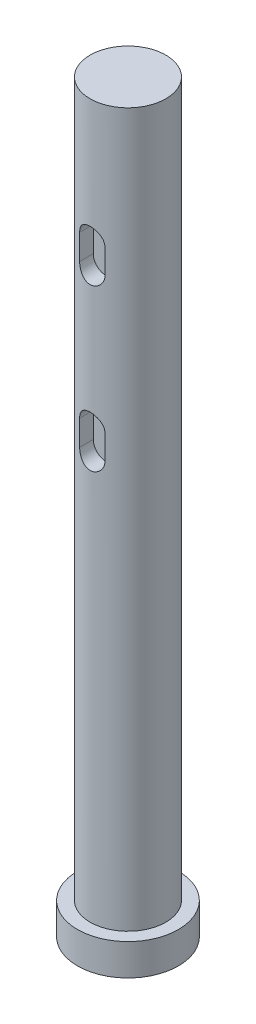
ISO-10303-21;
HEADER;
FILE_DESCRIPTION(('STEP AP214'),'2;1');
FILE_NAME('part.step','',(''),(''),'','','');
FILE_SCHEMA(('AUTOMOTIVE_DESIGN { 1 0 10303 214 1 1 1 1 }'));
ENDSEC;
DATA;
#1=APPLICATION_CONTEXT('core data for automotive mechanical design processes');
#2=APPLICATION_PROTOCOL_DEFINITION('international standard','automotive_design',2000,#1);
#3=PRODUCT_CONTEXT('',#1,'mechanical');
#4=PRODUCT('Part','Part','',(#3));
#5=PRODUCT_RELATED_PRODUCT_CATEGORY('part','',(#4));
#6=PRODUCT_DEFINITION_FORMATION('','',#4);
#7=PRODUCT_DEFINITION_CONTEXT('part definition',#1,'design');
#8=PRODUCT_DEFINITION('design','',#6,#7);
#9=PRODUCT_DEFINITION_SHAPE('','',#8);
#10=(LENGTH_UNIT() NAMED_UNIT(*) SI_UNIT(.MILLI.,.METRE.));
#11=(NAMED_UNIT(*) PLANE_ANGLE_UNIT() SI_UNIT($,.RADIAN.));
#12=(NAMED_UNIT(*) SI_UNIT($,.STERADIAN.) SOLID_ANGLE_UNIT());
#13=UNCERTAINTY_MEASURE_WITH_UNIT(LENGTH_MEASURE(1.E-05),#10,'distance_accuracy_value','');
#14=(GEOMETRIC_REPRESENTATION_CONTEXT(3) GLOBAL_UNCERTAINTY_ASSIGNED_CONTEXT((#13)) GLOBAL_UNIT_ASSIGNED_CONTEXT((#10,
#11,#12)) REPRESENTATION_CONTEXT('',''));
#15=CARTESIAN_POINT('',(0.,0.,0.));
#16=DIRECTION('',(0.,0.,1.));
#17=DIRECTION('',(1.,0.,0.));
#18=AXIS2_PLACEMENT_3D('',#15,#16,#17);
#19=CARTESIAN_POINT('',(8.0056,0.005599999999959,8.0056));
#20=DIRECTION('',(0.,1.,0.));
#21=DIRECTION('',(0.,0.,1.));
#22=AXIS2_PLACEMENT_3D('',#19,#20,#21);
#23=PLANE('',#22);
#24=CARTESIAN_POINT('',(8.0056,0.005600000000015,8.0056));
#25=DIRECTION('',(0.,1.,0.));
#26=DIRECTION('',(0.,0.,1.));
#27=AXIS2_PLACEMENT_3D('',#24,#25,#26);
#28=CIRCLE('',#27,8.);
#29=CARTESIAN_POINT('',(8.0056,0.005600000000015,16.0056));
#30=VERTEX_POINT('',#29);
#31=EDGE_CURVE('E19',#30,#30,#28,.T.);
#32=ORIENTED_EDGE('',*,*,#31,.F.);
#33=EDGE_LOOP('',(#32));
#34=FACE_BOUND('',#33,.T.);
#35=ADVANCED_FACE('F16',(#34),#23,.F.);
#36=CARTESIAN_POINT('',(8.0056,0.005599999999959,8.0056));
#37=DIRECTION('',(0.,1.,0.));
#38=DIRECTION('',(0.,0.,1.));
#39=AXIS2_PLACEMENT_3D('',#36,#37,#38);
#40=CYLINDRICAL_SURFACE('',#39,8.);
#41=ORIENTED_EDGE('',*,*,#31,.T.);
#42=EDGE_LOOP('',(#41));
#43=FACE_BOUND('',#42,.T.);
#44=CARTESIAN_POINT('',(8.0056,5.0056,8.0056));
#45=DIRECTION('',(0.,1.,0.));
#46=DIRECTION('',(0.,0.,1.));
#47=AXIS2_PLACEMENT_3D('',#44,#45,#46);
#48=CIRCLE('',#47,8.);
#49=CARTESIAN_POINT('',(8.0056,5.0056,16.0056));
#50=VERTEX_POINT('',#49);
#51=EDGE_CURVE('E196',#50,#50,#48,.T.);
#52=ORIENTED_EDGE('',*,*,#51,.F.);
#53=EDGE_LOOP('',(#52));
#54=FACE_BOUND('',#53,.T.);
#55=ADVANCED_FACE('F182',(#43,#54),#40,.T.);
#56=CARTESIAN_POINT('',(8.0056,118.0056,8.0056));
#57=DIRECTION('',(0.,1.,0.));
#58=DIRECTION('',(0.,0.,1.));
#59=AXIS2_PLACEMENT_3D('',#56,#57,#58);
#60=PLANE('',#59);
#61=CARTESIAN_POINT('',(8.0056,118.0056,8.0056));
#62=DIRECTION('',(0.,1.,0.));
#63=DIRECTION('',(0.,0.,1.));
#64=AXIS2_PLACEMENT_3D('',#61,#62,#63);
#65=CIRCLE('',#64,6.);
#66=CARTESIAN_POINT('',(8.0056,118.0056,14.0056));
#67=VERTEX_POINT('',#66);
#68=EDGE_CURVE('E97',#67,#67,#65,.F.);
#69=ORIENTED_EDGE('',*,*,#68,.F.);
#70=EDGE_LOOP('',(#69));
#71=FACE_BOUND('',#70,.T.);
#72=ADVANCED_FACE('F180',(#71),#60,.T.);
#73=CARTESIAN_POINT('',(8.0056,73.0056,11.5056));
#74=DIRECTION('',(0.,0.,1.));
#75=DIRECTION('',(1.,0.,0.));
#76=AXIS2_PLACEMENT_3D('',#73,#74,#75);
#77=PLANE('',#76);
#78=CARTESIAN_POINT('',(8.0056,73.0056,11.5056));
#79=DIRECTION('',(0.,0.,1.));
#80=DIRECTION('',(1.,0.,0.));
#81=AXIS2_PLACEMENT_3D('',#78,#79,#80);
#82=CIRCLE('',#81,2.);
#83=CARTESIAN_POINT('',(10.0056,73.0056,11.5056));
#84=VERTEX_POINT('',#83);
#85=CARTESIAN_POINT('',(6.0056,73.0056,11.5056));
#86=VERTEX_POINT('',#85);
#87=EDGE_CURVE('E201',#84,#86,#82,.T.);
#88=ORIENTED_EDGE('',*,*,#87,.T.);
#89=DIRECTION('',(0.,1.,0.));
#90=VECTOR('',#89,1.);
#91=CARTESIAN_POINT('',(6.0056,69.0056,11.5056));
#92=LINE('',#91,#90);
#93=CARTESIAN_POINT('',(6.0056,69.0056,11.5056));
#94=VERTEX_POINT('',#93);
#95=EDGE_CURVE('E84',#86,#94,#92,.F.);
#96=ORIENTED_EDGE('',*,*,#95,.T.);
#97=CARTESIAN_POINT('',(8.0056,69.0056,11.5056));
#98=DIRECTION('',(0.,0.,1.));
#99=DIRECTION('',(1.,0.,0.));
#100=AXIS2_PLACEMENT_3D('',#97,#98,#99);
#101=CIRCLE('',#100,2.);
#102=CARTESIAN_POINT('',(10.0056,69.0056,11.5056));
#103=VERTEX_POINT('',#102);
#104=EDGE_CURVE('E78',#94,#103,#101,.T.);
#105=ORIENTED_EDGE('',*,*,#104,.T.);
#106=DIRECTION('',(0.,1.,0.));
#107=VECTOR('',#106,1.);
#108=CARTESIAN_POINT('',(10.0056,69.0056,11.5056));
#109=LINE('',#108,#107);
#110=EDGE_CURVE('E81',#84,#103,#109,.F.);
#111=ORIENTED_EDGE('',*,*,#110,.F.);
#112=EDGE_LOOP('',(#88,#96,#105,#111));
#113=FACE_BOUND('',#112,.T.);
#114=ADVANCED_FACE('F80',(#113),#77,.T.);
#115=CARTESIAN_POINT('',(8.0056,98.5056,11.5056));
#116=DIRECTION('',(0.,0.,1.));
#117=DIRECTION('',(1.,0.,0.));
#118=AXIS2_PLACEMENT_3D('',#115,#116,#117);
#119=PLANE('',#118);
#120=CARTESIAN_POINT('',(8.0056,98.5056,11.5056));
#121=DIRECTION('',(0.,0.,1.));
#122=DIRECTION('',(1.,0.,0.));
#123=AXIS2_PLACEMENT_3D('',#120,#121,#122);
#124=CIRCLE('',#123,2.);
#125=CARTESIAN_POINT('',(10.0056,98.5056,11.5056));
#126=VERTEX_POINT('',#125);
#127=CARTESIAN_POINT('',(6.0056,98.5056,11.5056));
#128=VERTEX_POINT('',#127);
#129=EDGE_CURVE('E205',#126,#128,#124,.T.);
#130=ORIENTED_EDGE('',*,*,#129,.T.);
#131=DIRECTION('',(0.,1.,0.));
#132=VECTOR('',#131,1.);
#133=CARTESIAN_POINT('',(6.0056,94.5056,11.5056));
#134=LINE('',#133,#132);
#135=CARTESIAN_POINT('',(6.0056,94.5056,11.5056));
#136=VERTEX_POINT('',#135);
#137=EDGE_CURVE('E113',#128,#136,#134,.F.);
#138=ORIENTED_EDGE('',*,*,#137,.T.);
#139=CARTESIAN_POINT('',(8.0056,94.5056,11.5056));
#140=DIRECTION('',(0.,0.,1.));
#141=DIRECTION('',(1.,0.,0.));
#142=AXIS2_PLACEMENT_3D('',#139,#140,#141);
#143=CIRCLE('',#142,2.);
#144=CARTESIAN_POINT('',(10.0056,94.5056,11.5056));
#145=VERTEX_POINT('',#144);
#146=EDGE_CURVE('E112',#136,#145,#143,.T.);
#147=ORIENTED_EDGE('',*,*,#146,.T.);
#148=DIRECTION('',(0.,1.,0.));
#149=VECTOR('',#148,1.);
#150=CARTESIAN_POINT('',(10.0056,94.5056,11.5056));
#151=LINE('',#150,#149);
#152=EDGE_CURVE('E109',#126,#145,#151,.F.);
#153=ORIENTED_EDGE('',*,*,#152,.F.);
#154=EDGE_LOOP('',(#130,#138,#147,#153));
#155=FACE_BOUND('',#154,.T.);
#156=ADVANCED_FACE('F173',(#155),#119,.T.);
#157=CARTESIAN_POINT('',(8.0056,5.0056,8.0056));
#158=DIRECTION('',(0.,1.,0.));
#159=DIRECTION('',(0.,0.,1.));
#160=AXIS2_PLACEMENT_3D('',#157,#158,#159);
#161=PLANE('',#160);
#162=CARTESIAN_POINT('',(8.0056,5.0056,8.0056));
#163=DIRECTION('',(0.,1.,0.));
#164=DIRECTION('',(0.,0.,1.));
#165=AXIS2_PLACEMENT_3D('',#162,#163,#164);
#166=CIRCLE('',#165,6.);
#167=CARTESIAN_POINT('',(8.0056,5.0056,14.0056));
#168=VERTEX_POINT('',#167);
#169=EDGE_CURVE('E207',#168,#168,#166,.T.);
#170=ORIENTED_EDGE('',*,*,#169,.F.);
#171=EDGE_LOOP('',(#170));
#172=FACE_BOUND('',#171,.T.);
#173=ORIENTED_EDGE('',*,*,#51,.T.);
#174=EDGE_LOOP('',(#173));
#175=FACE_BOUND('',#174,.T.);
#176=ADVANCED_FACE('F170',(#172,#175),#161,.T.);
#177=CARTESIAN_POINT('',(10.0056,69.0056,11.5056));
#178=DIRECTION('',(-1.,0.,0.));
#179=DIRECTION('',(0.,0.,1.));
#180=AXIS2_PLACEMENT_3D('',#177,#178,#179);
#181=PLANE('',#180);
#182=DIRECTION('',(0.,0.,1.));
#183=VECTOR('',#182,1.);
#184=CARTESIAN_POINT('',(10.0056,69.0056,11.5056));
#185=LINE('',#184,#183);
#186=CARTESIAN_POINT('',(10.0056,69.0056,13.6624542494924));
#187=VERTEX_POINT('',#186);
#188=EDGE_CURVE('E88',#103,#187,#185,.T.);
#189=ORIENTED_EDGE('',*,*,#188,.T.);
#190=DIRECTION('',(0.,1.,0.));
#191=VECTOR('',#190,1.);
#192=CARTESIAN_POINT('',(10.0056000000001,5.0056,13.6624542494923));
#193=LINE('',#192,#191);
#194=CARTESIAN_POINT('',(10.0056000000001,73.0056,13.6624542494924));
#195=VERTEX_POINT('',#194);
#196=EDGE_CURVE('E209',#195,#187,#193,.F.);
#197=ORIENTED_EDGE('',*,*,#196,.F.);
#198=DIRECTION('',(0.,0.,1.));
#199=VECTOR('',#198,1.);
#200=CARTESIAN_POINT('',(10.0056,73.0056,11.5056));
#201=LINE('',#200,#199);
#202=EDGE_CURVE('E95',#195,#84,#201,.F.);
#203=ORIENTED_EDGE('',*,*,#202,.T.);
#204=ORIENTED_EDGE('',*,*,#110,.T.);
#205=EDGE_LOOP('',(#189,#197,#203,#204));
#206=FACE_BOUND('',#205,.T.);
#207=ADVANCED_FACE('F91',(#206),#181,.T.);
#208=CARTESIAN_POINT('',(8.0056,69.0056,11.5056));
#209=DIRECTION('',(0.,0.,1.));
#210=DIRECTION('',(1.,0.,0.));
#211=AXIS2_PLACEMENT_3D('',#208,#209,#210);
#212=CYLINDRICAL_SURFACE('',#211,2.);
#213=ORIENTED_EDGE('',*,*,#104,.F.);
#214=DIRECTION('',(0.,0.,1.));
#215=VECTOR('',#214,1.);
#216=CARTESIAN_POINT('',(6.0056,69.0056,11.5056));
#217=LINE('',#216,#215);
#218=CARTESIAN_POINT('',(6.00559999999994,69.0056,13.6624542494924));
#219=VERTEX_POINT('',#218);
#220=EDGE_CURVE('E104',#94,#219,#217,.T.);
#221=ORIENTED_EDGE('',*,*,#220,.T.);
#222=CARTESIAN_POINT('',(10.0056,69.0056,13.6624542494924));
#223=CARTESIAN_POINT('',(10.0056014949184,68.9510190063978,13.6624488418868));
#224=CARTESIAN_POINT('',(10.0033642491748,68.8964658756213,13.6632451988649));
#225=CARTESIAN_POINT('',(9.9944512140728,68.7877828318902,13.6663865457844));
#226=CARTESIAN_POINT('',(9.98777662286705,68.7336528086806,13.6687311176824));
#227=CARTESIAN_POINT('',(9.96122135046158,68.5728157136097,13.677981844493));
#228=CARTESIAN_POINT('',(9.93480846605623,68.467238307459,13.6871058499903));
#229=CARTESIAN_POINT('',(9.86551682366086,68.2623496151124,13.7101614939772));
#230=CARTESIAN_POINT('',(9.82264715197507,68.1630349062542,13.7240904790586));
#231=CARTESIAN_POINT('',(9.72174645792974,67.9729203319891,13.7551757443892));
#232=CARTESIAN_POINT('',(9.66370612564547,67.8821257418653,13.7723340045622));
#233=CARTESIAN_POINT('',(9.53170278704603,67.7081595373509,13.808689608041));
#234=CARTESIAN_POINT('',(9.45724996064407,67.6253702390748,13.8279375553662));
#235=CARTESIAN_POINT('',(9.29557688598296,67.4731879644166,13.8658769738596));
#236=CARTESIAN_POINT('',(9.20835436910907,67.4037973734881,13.8845683454371));
#237=CARTESIAN_POINT('',(9.02080729191253,67.2786409623916,13.9198776598845));
#238=CARTESIAN_POINT('',(8.920200178717,67.2232780311955,13.9364287512371));
#239=CARTESIAN_POINT('',(8.71045849993172,67.1304154966255,13.9649921720932));
#240=CARTESIAN_POINT('',(8.60132655118684,67.0929104363591,13.9770058878662));
#241=CARTESIAN_POINT('',(8.38165869095607,67.0381285478173,13.9947814228585));
#242=CARTESIAN_POINT('',(8.27130366892023,67.0201934548926,14.0007461797715));
#243=CARTESIAN_POINT('',(8.04899793891135,67.0029674029488,14.0064721680763));
#244=CARTESIAN_POINT('',(7.93704761750922,67.0036720014605,14.006234877626));
#245=CARTESIAN_POINT('',(7.71939230944122,67.0232885662133,13.9997207727053));
#246=CARTESIAN_POINT('',(7.61361459474893,67.0414852759189,13.9936812198253));
#247=CARTESIAN_POINT('',(7.40671187124669,67.0943863973482,13.9765392100165));
#248=CARTESIAN_POINT('',(7.30558712076707,67.1290917244125,13.9654364723546));
#249=CARTESIAN_POINT('',(7.10929475393808,67.2144427392013,13.9391133654261));
#250=CARTESIAN_POINT('',(7.01422298869202,67.2652920902447,13.9238407567662));
#251=CARTESIAN_POINT('',(6.83375082180502,67.3813199027814,13.8907677536009));
#252=CARTESIAN_POINT('',(6.74835306057063,67.446502262093,13.8729666719519));
#253=CARTESIAN_POINT('',(6.58540532057758,67.5929420999937,13.8357254388548));
#254=CARTESIAN_POINT('',(6.50841277677461,67.6748110872194,13.8162475735983));
#255=CARTESIAN_POINT('',(6.36905595035924,67.8504829794323,13.778549809457));
#256=CARTESIAN_POINT('',(6.30669639363238,67.9442897248065,13.7603303183151));
#257=CARTESIAN_POINT('',(6.19759334881444,68.1429603567066,13.7270006275264));
#258=CARTESIAN_POINT('',(6.15109398098464,68.2479670298659,13.7119402989647));
#259=CARTESIAN_POINT('',(6.07667953859777,68.4648939551799,13.6872219412408));
#260=CARTESIAN_POINT('',(6.04873512788929,68.5768029867443,13.6775553881799));
#261=CARTESIAN_POINT('',(6.02228368743834,68.742437273496,13.6683308418944));
#262=CARTESIAN_POINT('',(6.01602987748977,68.7948827797085,13.666133353892));
#263=CARTESIAN_POINT('',(6.00769076785761,68.9000761567996,13.663194071428));
#264=CARTESIAN_POINT('',(6.00560008921004,68.9528235490888,13.6624503985906));
#265=CARTESIAN_POINT('',(6.0056,69.0056,13.6624542494924));
#266=B_SPLINE_CURVE_WITH_KNOTS('',3,(#222,#223,#224,#225,#226,#227,#228,#229,#230,#231,#232,
#233,#234,#235,#236,#237,#238,#239,#240,#241,#242,#243,#244,#245,#246,#247,#248,#249,#250,#251,
#252,#253,#254,#255,#256,#257,#258,#259,#260,#261,#262,#263,#264,#265),.UNSPECIFIED.,.F.,.F.,(4,
2,2,2,2,2,2,2,2,2,2,2,2,2,2,2,2,2,2,2,2,4),(0.,0.163636969470867,0.327229772338933,
0.653162396790742,0.978915321932481,1.30486862627062,1.64233009925356,1.97985159727495,
2.32618265866202,2.67240782242254,3.00658941454805,3.34069136061284,3.6616883693147,
3.98270317816495,4.30794037651935,4.63326613177537,4.973881081161,5.31460588498483,
5.6603605985608,6.00556734973679,6.16399790665502,6.32222363058113),.UNSPECIFIED.);
#267=EDGE_CURVE('E101',#187,#219,#266,.T.);
#268=ORIENTED_EDGE('',*,*,#267,.F.);
#269=ORIENTED_EDGE('',*,*,#188,.F.);
#270=EDGE_LOOP('',(#213,#221,#268,#269));
#271=FACE_BOUND('',#270,.T.);
#272=ADVANCED_FACE('F99',(#271),#212,.F.);
#273=CARTESIAN_POINT('',(6.0056,69.0056,11.5056));
#274=DIRECTION('',(-1.,0.,0.));
#275=DIRECTION('',(0.,0.,1.));
#276=AXIS2_PLACEMENT_3D('',#273,#274,#275);
#277=PLANE('',#276);
#278=ORIENTED_EDGE('',*,*,#220,.F.);
#279=ORIENTED_EDGE('',*,*,#95,.F.);
#280=DIRECTION('',(0.,0.,1.));
#281=VECTOR('',#280,1.);
#282=CARTESIAN_POINT('',(6.0056,73.0056,11.5056));
#283=LINE('',#282,#281);
#284=CARTESIAN_POINT('',(6.00559999999997,73.0056,13.6624542494924));
#285=VERTEX_POINT('',#284);
#286=EDGE_CURVE('E203',#86,#285,#283,.T.);
#287=ORIENTED_EDGE('',*,*,#286,.T.);
#288=DIRECTION('',(0.,1.,0.));
#289=VECTOR('',#288,1.);
#290=CARTESIAN_POINT('',(6.00559999999988,5.0056,13.6624542494923));
#291=LINE('',#290,#289);
#292=EDGE_CURVE('E154',#219,#285,#291,.T.);
#293=ORIENTED_EDGE('',*,*,#292,.F.);
#294=EDGE_LOOP('',(#278,#279,#287,#293));
#295=FACE_BOUND('',#294,.T.);
#296=ADVANCED_FACE('F161',(#295),#277,.F.);
#297=CARTESIAN_POINT('',(8.0056,73.0056,11.5056));
#298=DIRECTION('',(0.,0.,1.));
#299=DIRECTION('',(1.,0.,0.));
#300=AXIS2_PLACEMENT_3D('',#297,#298,#299);
#301=CYLINDRICAL_SURFACE('',#300,2.);
#302=ORIENTED_EDGE('',*,*,#202,.F.);
#303=CARTESIAN_POINT('',(6.0056,73.0056,13.6624542494924));
#304=CARTESIAN_POINT('',(6.00559850624157,73.060181043276,13.6624488417915));
#305=CARTESIAN_POINT('',(6.00783575548745,73.1147342237887,13.6632452002712));
#306=CARTESIAN_POINT('',(6.01674880564261,73.2234173659418,13.6663865529645));
#307=CARTESIAN_POINT('',(6.02342340840321,73.2775474378369,13.6687311291361));
#308=CARTESIAN_POINT('',(6.04997870019692,73.4383844796973,13.6779818610091));
#309=CARTESIAN_POINT('',(6.07639157751267,73.5439617859732,13.6871058599621));
#310=CARTESIAN_POINT('',(6.14568366508585,73.7488518654422,13.7101616611221));
#311=CARTESIAN_POINT('',(6.18855404214299,73.8481679659655,13.7240908838253));
#312=CARTESIAN_POINT('',(6.28945527436856,74.03828230939,13.7551762412292));
#313=CARTESIAN_POINT('',(6.34749500195489,74.129075524951,13.7723342627757));
#314=CARTESIAN_POINT('',(6.47949115818669,74.3030327100807,13.8086879946594));
#315=CARTESIAN_POINT('',(6.55393630585713,74.3858152014007,13.8279341977329));
#316=CARTESIAN_POINT('',(6.71560854798993,74.537999956906,13.8658736905898));
#317=CARTESIAN_POINT('',(6.80284013719092,74.6073974960141,13.8845667831531));
#318=CARTESIAN_POINT('',(6.99043407211067,74.7325881443538,13.9198859894257));
#319=CARTESIAN_POINT('',(7.09108301122845,74.7879722318204,13.9364442416713));
#320=CARTESIAN_POINT('',(7.30085343273793,74.8808206385709,13.9650032607106));
#321=CARTESIAN_POINT('',(7.40996432519142,74.9183069489016,13.9770096166746));
#322=CARTESIAN_POINT('',(7.60055946356335,74.9658475410318,13.9924387714056));
#323=CARTESIAN_POINT('',(7.68075339051294,74.980723920689,13.99734657628));
#324=CARTESIAN_POINT('',(7.84248815911964,75.0006015875116,14.0039283422143));
#325=CARTESIAN_POINT('',(7.92402892575966,75.0056034228174,14.0056024827762));
#326=CARTESIAN_POINT('',(8.11465278928019,75.0055954240178,14.0055966807637));
#327=CARTESIAN_POINT('',(8.2237597478006,74.9966448732045,14.0025967068463));
#328=CARTESIAN_POINT('',(8.43881301651922,74.9611629807985,13.9909116506116));
#329=CARTESIAN_POINT('',(8.54475655846121,74.9346166869064,13.9822217332389));
#330=CARTESIAN_POINT('',(8.75026935491201,74.8649590956721,13.9601052481273));
#331=CARTESIAN_POINT('',(8.84985082015528,74.8218807150683,13.9466880970194));
#332=CARTESIAN_POINT('',(9.04036127570406,74.7205108040547,13.9164869935015));
#333=CARTESIAN_POINT('',(9.13128957944319,74.6622180678658,13.8997027742667));
#334=CARTESIAN_POINT('',(9.30508057173709,74.5299504992917,13.8638824138619));
#335=CARTESIAN_POINT('',(9.38760242703585,74.4555425405013,13.8447922922297));
#336=CARTESIAN_POINT('',(9.53926153903483,74.2940700724964,13.8068073424053));
#337=CARTESIAN_POINT('',(9.60839506987143,74.2070020518569,13.7879125699581));
#338=CARTESIAN_POINT('',(9.73327175144752,74.0195988371862,13.7518604100399));
#339=CARTESIAN_POINT('',(9.78856692362324,73.9189514041937,13.7347695441861));
#340=CARTESIAN_POINT('',(9.88126629037052,73.7091601745916,13.7050962998798));
#341=CARTESIAN_POINT('',(9.91868852503714,73.6000250750028,13.6925093785923));
#342=CARTESIAN_POINT('',(9.96604949514537,73.4096027414,13.6763210466587));
#343=CARTESIAN_POINT('',(9.98084301676809,73.3296239074553,13.671163184869));
#344=CARTESIAN_POINT('',(10.000632147639,73.1683153694485,13.6642107410329));
#345=CARTESIAN_POINT('',(10.0056268628661,73.0869855428074,13.6624164658732));
#346=CARTESIAN_POINT('',(10.0056,73.0056,13.6624542494924));
#347=B_SPLINE_CURVE_WITH_KNOTS('',3,(#303,#304,#305,#306,#307,#308,#309,#310,#311,#312,#313,
#314,#315,#316,#317,#318,#319,#320,#321,#322,#323,#324,#325,#326,#327,#328,#329,#330,#331,#332,
#333,#334,#335,#336,#337,#338,#339,#340,#341,#342,#343,#344,#345,#346),.UNSPECIFIED.,.F.,.F.,(4,
2,2,2,2,2,2,2,2,2,2,2,2,2,2,2,2,2,2,2,2,4),(0.,0.163637118481624,0.327230070545704,
0.653162397592181,0.978920031678613,1.30486862655437,1.64230066113899,1.9798515968479,
2.32634313894962,2.67240784330359,2.91690557900246,3.16138974213691,3.4882418790364,
3.81537212111243,4.14185437137158,4.46836250409951,4.80507367423101,5.14187841415668,
5.48847983044703,5.8347306604678,6.07859129287807,6.32247417355027),.UNSPECIFIED.);
#348=EDGE_CURVE('E147',#285,#195,#347,.T.);
#349=ORIENTED_EDGE('',*,*,#348,.F.);
#350=ORIENTED_EDGE('',*,*,#286,.F.);
#351=ORIENTED_EDGE('',*,*,#87,.F.);
#352=EDGE_LOOP('',(#302,#349,#350,#351));
#353=FACE_BOUND('',#352,.T.);
#354=ADVANCED_FACE('F155',(#353),#301,.F.);
#355=CARTESIAN_POINT('',(10.0056,94.5056,11.5056));
#356=DIRECTION('',(-1.,0.,0.));
#357=DIRECTION('',(0.,0.,1.));
#358=AXIS2_PLACEMENT_3D('',#355,#356,#357);
#359=PLANE('',#358);
#360=DIRECTION('',(0.,0.,1.));
#361=VECTOR('',#360,1.);
#362=CARTESIAN_POINT('',(10.0056,94.5056,11.5056));
#363=LINE('',#362,#361);
#364=CARTESIAN_POINT('',(10.0056,94.5056,13.6624542494924));
#365=VERTEX_POINT('',#364);
#366=EDGE_CURVE('E115',#145,#365,#363,.T.);
#367=ORIENTED_EDGE('',*,*,#366,.T.);
#368=DIRECTION('',(0.,1.,0.));
#369=VECTOR('',#368,1.);
#370=CARTESIAN_POINT('',(10.0056000000001,5.0056,13.6624542494923));
#371=LINE('',#370,#369);
#372=CARTESIAN_POINT('',(10.0056000000001,98.5056,13.6624542494924));
#373=VERTEX_POINT('',#372);
#374=EDGE_CURVE('E153',#373,#365,#371,.F.);
#375=ORIENTED_EDGE('',*,*,#374,.F.);
#376=DIRECTION('',(0.,0.,1.));
#377=VECTOR('',#376,1.);
#378=CARTESIAN_POINT('',(10.0056,98.5056,11.5056));
#379=LINE('',#378,#377);
#380=EDGE_CURVE('E206',#373,#126,#379,.F.);
#381=ORIENTED_EDGE('',*,*,#380,.T.);
#382=ORIENTED_EDGE('',*,*,#152,.T.);
#383=EDGE_LOOP('',(#367,#375,#381,#382));
#384=FACE_BOUND('',#383,.T.);
#385=ADVANCED_FACE('F160',(#384),#359,.T.);
#386=CARTESIAN_POINT('',(8.0056,94.5056,11.5056));
#387=DIRECTION('',(0.,0.,1.));
#388=DIRECTION('',(1.,0.,0.));
#389=AXIS2_PLACEMENT_3D('',#386,#387,#388);
#390=CYLINDRICAL_SURFACE('',#389,2.);
#391=ORIENTED_EDGE('',*,*,#146,.F.);
#392=DIRECTION('',(0.,0.,1.));
#393=VECTOR('',#392,1.);
#394=CARTESIAN_POINT('',(6.0056,94.5056,11.5056));
#395=LINE('',#394,#393);
#396=CARTESIAN_POINT('',(6.00559999999994,94.5056,13.6624542494924));
#397=VERTEX_POINT('',#396);
#398=EDGE_CURVE('E114',#136,#397,#395,.T.);
#399=ORIENTED_EDGE('',*,*,#398,.T.);
#400=CARTESIAN_POINT('',(10.0056,94.5056,13.6624542494924));
#401=CARTESIAN_POINT('',(10.0056014949184,94.4510190063978,13.6624488418868));
#402=CARTESIAN_POINT('',(10.0033642491748,94.3964658756214,13.6632451988649));
#403=CARTESIAN_POINT('',(9.9944512140728,94.2877828318902,13.6663865457844));
#404=CARTESIAN_POINT('',(9.98777662286705,94.2336528086806,13.6687311176824));
#405=CARTESIAN_POINT('',(9.96122135046158,94.0728157136097,13.677981844493));
#406=CARTESIAN_POINT('',(9.93480846605623,93.9672383074591,13.6871058499903));
#407=CARTESIAN_POINT('',(9.86551682366086,93.7623496151125,13.7101614939772));
#408=CARTESIAN_POINT('',(9.82264715197507,93.6630349062542,13.7240904790586));
#409=CARTESIAN_POINT('',(9.72174645792974,93.4729203319891,13.7551757443892));
#410=CARTESIAN_POINT('',(9.66370612564548,93.3821257418653,13.7723340045622));
#411=CARTESIAN_POINT('',(9.53170278704603,93.2081595373509,13.808689608041));
#412=CARTESIAN_POINT('',(9.45724996064407,93.1253702390748,13.8279375553662));
#413=CARTESIAN_POINT('',(9.29557688598297,92.9731879644166,13.8658769738596));
#414=CARTESIAN_POINT('',(9.20835436910907,92.9037973734881,13.8845683454371));
#415=CARTESIAN_POINT('',(9.02080729191253,92.7786409623916,13.9198776598845));
#416=CARTESIAN_POINT('',(8.920200178717,92.7232780311955,13.9364287512371));
#417=CARTESIAN_POINT('',(8.71045849993172,92.6304154966255,13.9649921720932));
#418=CARTESIAN_POINT('',(8.60132655118684,92.5929104363591,13.9770058878662));
#419=CARTESIAN_POINT('',(8.38165869095607,92.5381285478173,13.9947814228585));
#420=CARTESIAN_POINT('',(8.27130366892023,92.5201934548926,14.0007461797715));
#421=CARTESIAN_POINT('',(8.04899793891135,92.5029674029488,14.0064721680763));
#422=CARTESIAN_POINT('',(7.93704761750922,92.5036720014605,14.006234877626));
#423=CARTESIAN_POINT('',(7.71939230944122,92.5232885662133,13.9997207727053));
#424=CARTESIAN_POINT('',(7.61361459474893,92.5414852759189,13.9936812198253));
#425=CARTESIAN_POINT('',(7.40671187124669,92.5943863973482,13.9765392100165));
#426=CARTESIAN_POINT('',(7.30558712076708,92.6290917244125,13.9654364723546));
#427=CARTESIAN_POINT('',(7.10929475393808,92.7144427392013,13.9391133654261));
#428=CARTESIAN_POINT('',(7.01422298869202,92.7652920902447,13.9238407567663));
#429=CARTESIAN_POINT('',(6.83375082180503,92.8813199027814,13.8907677536009));
#430=CARTESIAN_POINT('',(6.74835306057063,92.946502262093,13.8729666719519));
#431=CARTESIAN_POINT('',(6.58540532057758,93.0929420999937,13.8357254388548));
#432=CARTESIAN_POINT('',(6.50841277677461,93.1748110872194,13.8162475735983));
#433=CARTESIAN_POINT('',(6.36905595035924,93.3504829794323,13.778549809457));
#434=CARTESIAN_POINT('',(6.30669639363238,93.4442897248065,13.7603303183151));
#435=CARTESIAN_POINT('',(6.19759334881443,93.6429603567066,13.7270006275264));
#436=CARTESIAN_POINT('',(6.15109398098463,93.7479670298659,13.7119402989647));
#437=CARTESIAN_POINT('',(6.07667953859777,93.9648939551799,13.6872219412408));
#438=CARTESIAN_POINT('',(6.04873512788929,94.0768029867443,13.6775553881799));
#439=CARTESIAN_POINT('',(6.02228368743834,94.242437273496,13.6683308418944));
#440=CARTESIAN_POINT('',(6.01602987748977,94.2948827797084,13.666133353892));
#441=CARTESIAN_POINT('',(6.00769076785761,94.4000761567996,13.663194071428));
#442=CARTESIAN_POINT('',(6.00560008921004,94.4528235490888,13.6624503985906));
#443=CARTESIAN_POINT('',(6.0056,94.5056,13.6624542494924));
#444=B_SPLINE_CURVE_WITH_KNOTS('',3,(#400,#401,#402,#403,#404,#405,#406,#407,#408,#409,#410,
#411,#412,#413,#414,#415,#416,#417,#418,#419,#420,#421,#422,#423,#424,#425,#426,#427,#428,#429,
#430,#431,#432,#433,#434,#435,#436,#437,#438,#439,#440,#441,#442,#443),.UNSPECIFIED.,.F.,.F.,(4,
2,2,2,2,2,2,2,2,2,2,2,2,2,2,2,2,2,2,2,2,4),(0.,0.163636969470853,0.327229772338919,
0.653162396790742,0.978915321932465,1.30486862627062,1.64233009925354,1.97985159727494,
2.32618265866202,2.67240782242254,3.00658941454805,3.34069136061284,3.66168836931469,
3.98270317816495,4.30794037651934,4.63326613177536,4.97388108116099,5.31460588498483,
5.66036059856081,6.00556734973678,6.163997906655,6.32222363058113),.UNSPECIFIED.);
#445=EDGE_CURVE('E123',#365,#397,#444,.T.);
#446=ORIENTED_EDGE('',*,*,#445,.F.);
#447=ORIENTED_EDGE('',*,*,#366,.F.);
#448=EDGE_LOOP('',(#391,#399,#446,#447));
#449=FACE_BOUND('',#448,.T.);
#450=ADVANCED_FACE('F239',(#449),#390,.F.);
#451=CARTESIAN_POINT('',(6.0056,94.5056,11.5056));
#452=DIRECTION('',(-1.,0.,0.));
#453=DIRECTION('',(0.,0.,1.));
#454=AXIS2_PLACEMENT_3D('',#451,#452,#453);
#455=PLANE('',#454);
#456=ORIENTED_EDGE('',*,*,#398,.F.);
#457=ORIENTED_EDGE('',*,*,#137,.F.);
#458=DIRECTION('',(0.,0.,1.));
#459=VECTOR('',#458,1.);
#460=CARTESIAN_POINT('',(6.0056,98.5056,11.5056));
#461=LINE('',#460,#459);
#462=CARTESIAN_POINT('',(6.00559999999997,98.5056,13.6624542494924));
#463=VERTEX_POINT('',#462);
#464=EDGE_CURVE('E34',#128,#463,#461,.T.);
#465=ORIENTED_EDGE('',*,*,#464,.T.);
#466=DIRECTION('',(0.,1.,0.));
#467=VECTOR('',#466,1.);
#468=CARTESIAN_POINT('',(6.00559999999988,5.0056,13.6624542494923));
#469=LINE('',#468,#467);
#470=EDGE_CURVE('E25',#397,#463,#469,.T.);
#471=ORIENTED_EDGE('',*,*,#470,.F.);
#472=EDGE_LOOP('',(#456,#457,#465,#471));
#473=FACE_BOUND('',#472,.T.);
#474=ADVANCED_FACE('F241',(#473),#455,.F.);
#475=CARTESIAN_POINT('',(8.0056,98.5056,11.5056));
#476=DIRECTION('',(0.,0.,1.));
#477=DIRECTION('',(1.,0.,0.));
#478=AXIS2_PLACEMENT_3D('',#475,#476,#477);
#479=CYLINDRICAL_SURFACE('',#478,2.);
#480=ORIENTED_EDGE('',*,*,#380,.F.);
#481=CARTESIAN_POINT('',(6.0056,98.5056,13.6624542494924));
#482=CARTESIAN_POINT('',(6.00559850624157,98.560181043276,13.6624488417915));
#483=CARTESIAN_POINT('',(6.00783575548745,98.6147342237887,13.6632452002712));
#484=CARTESIAN_POINT('',(6.01674880564261,98.7234173659418,13.6663865529645));
#485=CARTESIAN_POINT('',(6.02342340840321,98.7775474378369,13.6687311291361));
#486=CARTESIAN_POINT('',(6.04997870019692,98.9383844796973,13.6779818610091));
#487=CARTESIAN_POINT('',(6.07639157751267,99.0439617859732,13.6871058599621));
#488=CARTESIAN_POINT('',(6.14568366508585,99.2488518654422,13.7101616611221));
#489=CARTESIAN_POINT('',(6.188554042143,99.3481679659655,13.7240908838253));
#490=CARTESIAN_POINT('',(6.28945527436857,99.53828230939,13.7551762412292));
#491=CARTESIAN_POINT('',(6.3474950019549,99.629075524951,13.7723342627757));
#492=CARTESIAN_POINT('',(6.47949115818669,99.8030327100807,13.8086879946594));
#493=CARTESIAN_POINT('',(6.55393630585713,99.8858152014007,13.8279341977329));
#494=CARTESIAN_POINT('',(6.71560854798993,100.037999956906,13.8658736905898));
#495=CARTESIAN_POINT('',(6.80284013719092,100.107397496014,13.8845667831531));
#496=CARTESIAN_POINT('',(6.99043407211067,100.232588144354,13.9198859894257));
#497=CARTESIAN_POINT('',(7.09108301122845,100.28797223182,13.9364442416713));
#498=CARTESIAN_POINT('',(7.30085343273793,100.380820638571,13.9650032607106));
#499=CARTESIAN_POINT('',(7.40996432519142,100.418306948902,13.9770096166746));
#500=CARTESIAN_POINT('',(7.60055946356335,100.465847541032,13.9924387714056));
#501=CARTESIAN_POINT('',(7.68075339051294,100.480723920689,13.99734657628));
#502=CARTESIAN_POINT('',(7.84248815911964,100.500601587512,14.0039283422143));
#503=CARTESIAN_POINT('',(7.92402892575966,100.505603422817,14.0056024827762));
#504=CARTESIAN_POINT('',(8.11465278928019,100.505595424018,14.0055966807637));
#505=CARTESIAN_POINT('',(8.2237597478006,100.496644873205,14.0025967068463));
#506=CARTESIAN_POINT('',(8.43881301651922,100.461162980798,13.9909116506116));
#507=CARTESIAN_POINT('',(8.54475655846121,100.434616686906,13.9822217332389));
#508=CARTESIAN_POINT('',(8.750269354912,100.364959095672,13.9601052481273));
#509=CARTESIAN_POINT('',(8.84985082015527,100.321880715068,13.9466880970194));
#510=CARTESIAN_POINT('',(9.04036127570406,100.220510804055,13.9164869935015));
#511=CARTESIAN_POINT('',(9.13128957944318,100.162218067866,13.8997027742667));
#512=CARTESIAN_POINT('',(9.3050805717371,100.029950499292,13.8638824138619));
#513=CARTESIAN_POINT('',(9.38760242703585,99.9555425405013,13.8447922922297));
#514=CARTESIAN_POINT('',(9.53926153903483,99.7940700724964,13.8068073424053));
#515=CARTESIAN_POINT('',(9.60839506987143,99.7070020518569,13.7879125699581));
#516=CARTESIAN_POINT('',(9.73327175144752,99.5195988371862,13.7518604100399));
#517=CARTESIAN_POINT('',(9.78856692362324,99.4189514041937,13.7347695441861));
#518=CARTESIAN_POINT('',(9.88126629037052,99.2091601745916,13.7050962998798));
#519=CARTESIAN_POINT('',(9.91868852503714,99.1000250750028,13.6925093785923));
#520=CARTESIAN_POINT('',(9.96604949514537,98.9096027414,13.6763210466587));
#521=CARTESIAN_POINT('',(9.98084301676809,98.8296239074553,13.671163184869));
#522=CARTESIAN_POINT('',(10.000632147639,98.6683153694485,13.6642107410329));
#523=CARTESIAN_POINT('',(10.0056268628661,98.5869855428074,13.6624164658732));
#524=CARTESIAN_POINT('',(10.0056,98.5056,13.6624542494924));
#525=B_SPLINE_CURVE_WITH_KNOTS('',3,(#481,#482,#483,#484,#485,#486,#487,#488,#489,#490,#491,
#492,#493,#494,#495,#496,#497,#498,#499,#500,#501,#502,#503,#504,#505,#506,#507,#508,#509,#510,
#511,#512,#513,#514,#515,#516,#517,#518,#519,#520,#521,#522,#523,#524),.UNSPECIFIED.,.F.,.F.,(4,
2,2,2,2,2,2,2,2,2,2,2,2,2,2,2,2,2,2,2,2,4),(0.,0.163637118481624,0.327230070545704,
0.653162397592181,0.978920031678629,1.30486862655437,1.64230066113899,1.9798515968479,
2.32634313894962,2.67240784330359,2.91690557900246,3.16138974213691,3.4882418790364,
3.81537212111243,4.14185437137158,4.46836250409951,4.80507367423101,5.14187841415668,
5.48847983044703,5.8347306604678,6.07859129287807,6.32247417355027),.UNSPECIFIED.);
#526=EDGE_CURVE('E11',#463,#373,#525,.T.);
#527=ORIENTED_EDGE('',*,*,#526,.F.);
#528=ORIENTED_EDGE('',*,*,#464,.F.);
#529=ORIENTED_EDGE('',*,*,#129,.F.);
#530=EDGE_LOOP('',(#480,#527,#528,#529));
#531=FACE_BOUND('',#530,.T.);
#532=ADVANCED_FACE('F130',(#531),#479,.F.);
#533=CARTESIAN_POINT('',(8.0056,5.0056,8.0056));
#534=DIRECTION('',(0.,1.,0.));
#535=DIRECTION('',(0.,0.,1.));
#536=AXIS2_PLACEMENT_3D('',#533,#534,#535);
#537=CYLINDRICAL_SURFACE('',#536,6.);
#538=ORIENTED_EDGE('',*,*,#68,.T.);
#539=EDGE_LOOP('',(#538));
#540=FACE_BOUND('',#539,.T.);
#541=ORIENTED_EDGE('',*,*,#526,.T.);
#542=ORIENTED_EDGE('',*,*,#374,.T.);
#543=ORIENTED_EDGE('',*,*,#445,.T.);
#544=ORIENTED_EDGE('',*,*,#470,.T.);
#545=EDGE_LOOP('',(#541,#542,#543,#544));
#546=FACE_BOUND('',#545,.T.);
#547=ORIENTED_EDGE('',*,*,#348,.T.);
#548=ORIENTED_EDGE('',*,*,#196,.T.);
#549=ORIENTED_EDGE('',*,*,#267,.T.);
#550=ORIENTED_EDGE('',*,*,#292,.T.);
#551=EDGE_LOOP('',(#547,#548,#549,#550));
#552=FACE_BOUND('',#551,.T.);
#553=ORIENTED_EDGE('',*,*,#169,.T.);
#554=EDGE_LOOP('',(#553));
#555=FACE_BOUND('',#554,.T.);
#556=ADVANCED_FACE('F133',(#540,#546,#552,#555),#537,.T.);
#557=CLOSED_SHELL('',(#35,#55,#72,#114,#156,#176,#207,#272,#296,#354,#385,#450,#474,#532,#556));
#558=MANIFOLD_SOLID_BREP('B1',#557);
#559=ADVANCED_BREP_SHAPE_REPRESENTATION('',(#18,#558),#14);
#560=SHAPE_DEFINITION_REPRESENTATION(#9,#559);
ENDSEC;
END-ISO-10303-21;
